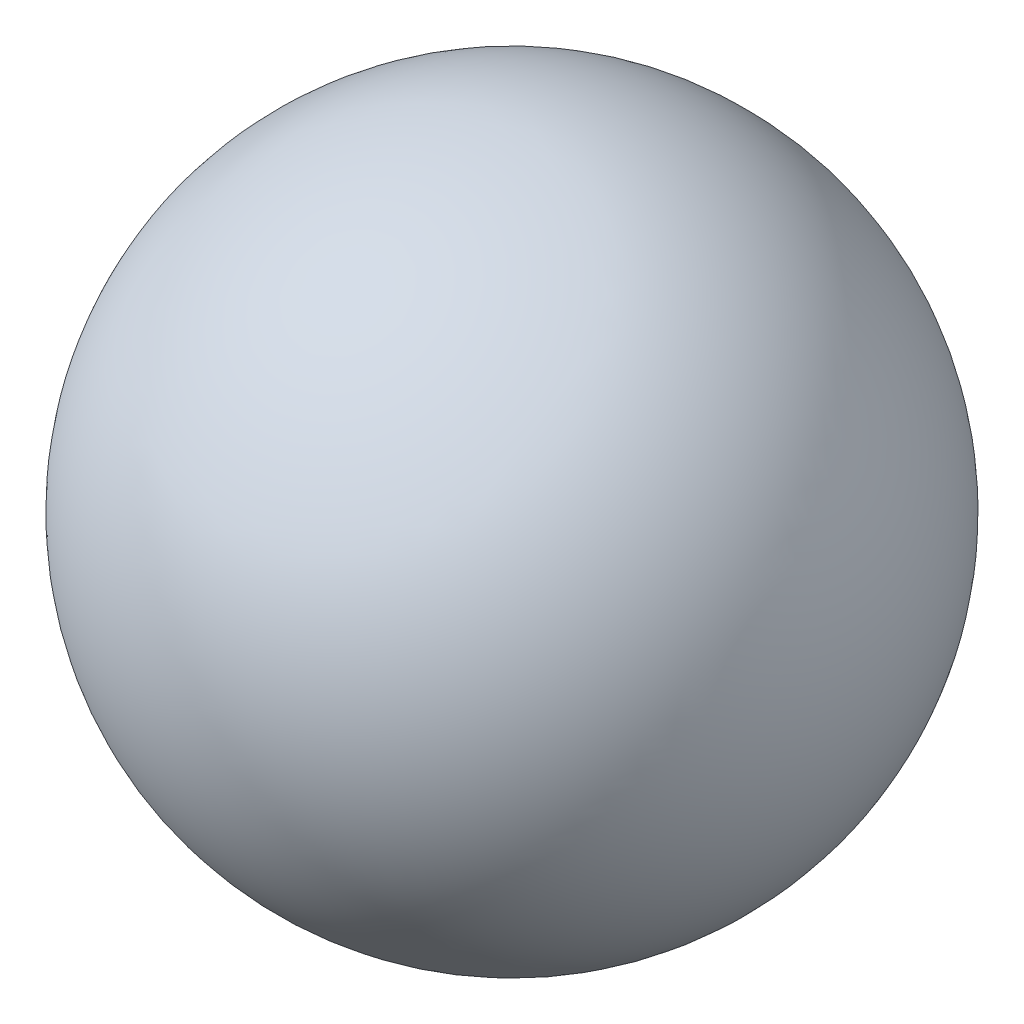
ISO-10303-21;
HEADER;
FILE_DESCRIPTION(('STEP AP214'),'2;1');
FILE_NAME('part.step','',(''),(''),'','','');
FILE_SCHEMA(('AUTOMOTIVE_DESIGN { 1 0 10303 214 1 1 1 1 }'));
ENDSEC;
DATA;
#1=APPLICATION_CONTEXT('core data for automotive mechanical design processes');
#2=APPLICATION_PROTOCOL_DEFINITION('international standard','automotive_design',2000,#1);
#3=PRODUCT_CONTEXT('',#1,'mechanical');
#4=PRODUCT('Part','Part','',(#3));
#5=PRODUCT_RELATED_PRODUCT_CATEGORY('part','',(#4));
#6=PRODUCT_DEFINITION_FORMATION('','',#4);
#7=PRODUCT_DEFINITION_CONTEXT('part definition',#1,'design');
#8=PRODUCT_DEFINITION('design','',#6,#7);
#9=PRODUCT_DEFINITION_SHAPE('','',#8);
#10=(LENGTH_UNIT() NAMED_UNIT(*) SI_UNIT(.MILLI.,.METRE.));
#11=(NAMED_UNIT(*) PLANE_ANGLE_UNIT() SI_UNIT($,.RADIAN.));
#12=(NAMED_UNIT(*) SI_UNIT($,.STERADIAN.) SOLID_ANGLE_UNIT());
#13=UNCERTAINTY_MEASURE_WITH_UNIT(LENGTH_MEASURE(1.E-05),#10,'distance_accuracy_value','');
#14=(GEOMETRIC_REPRESENTATION_CONTEXT(3) GLOBAL_UNCERTAINTY_ASSIGNED_CONTEXT((#13)) GLOBAL_UNIT_ASSIGNED_CONTEXT((#10,
#11,#12)) REPRESENTATION_CONTEXT('',''));
#15=CARTESIAN_POINT('',(0.,0.,0.));
#16=DIRECTION('',(0.,0.,1.));
#17=DIRECTION('',(1.,0.,0.));
#18=AXIS2_PLACEMENT_3D('',#15,#16,#17);
#19=CARTESIAN_POINT('',(-3.96875,0.,0.));
#20=DIRECTION('',(-1.,0.,0.));
#21=DIRECTION('',(0.,-1.,0.));
#22=AXIS2_PLACEMENT_3D('',#19,#20,#21);
#23=SPHERICAL_SURFACE('',#22,0.758760243513405);
#24=CARTESIAN_POINT('',(-4.7275102435134,0.,0.));
#25=VERTEX_POINT('',#24);
#26=VERTEX_LOOP('',#25);
#27=FACE_BOUND('',#26,.T.);
#28=ADVANCED_FACE('F34',(#27),#23,.T.);
#29=CLOSED_SHELL('',(#28));
#30=MANIFOLD_SOLID_BREP('B2',#29);
#31=ADVANCED_BREP_SHAPE_REPRESENTATION('',(#18,#30),#14);
#32=SHAPE_DEFINITION_REPRESENTATION(#9,#31);
ENDSEC;
END-ISO-10303-21;
